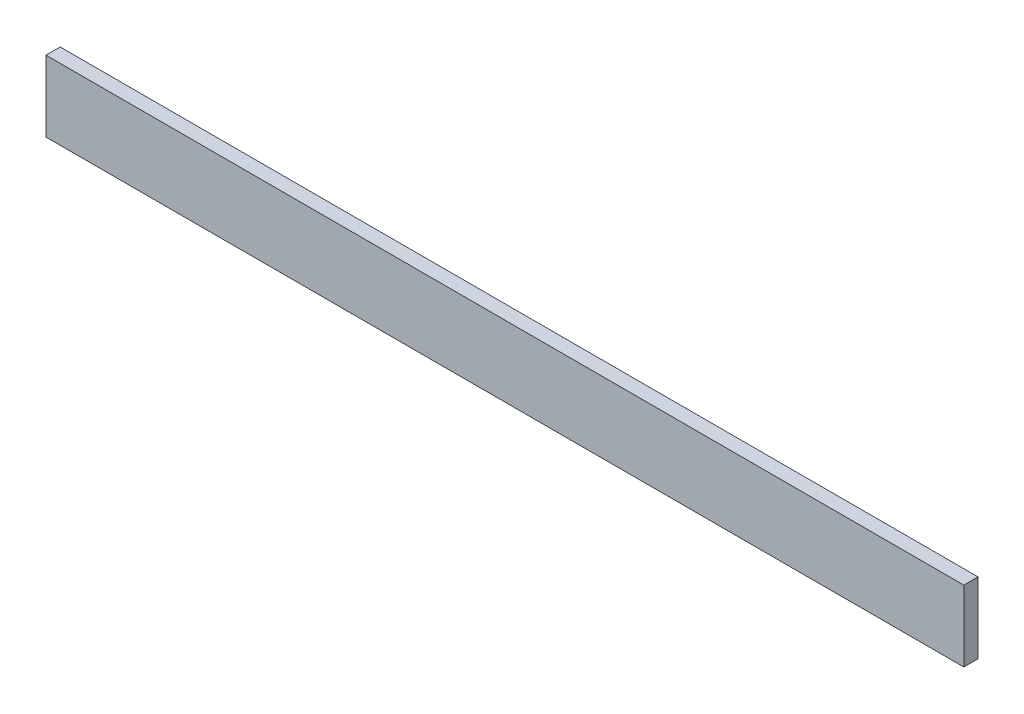
ISO-10303-21;
HEADER;
FILE_DESCRIPTION(('STEP AP214'),'2;1');
FILE_NAME('part.step','',(''),(''),'','','');
FILE_SCHEMA(('AUTOMOTIVE_DESIGN { 1 0 10303 214 1 1 1 1 }'));
ENDSEC;
DATA;
#1=APPLICATION_CONTEXT('core data for automotive mechanical design processes');
#2=APPLICATION_PROTOCOL_DEFINITION('international standard','automotive_design',2000,#1);
#3=PRODUCT_CONTEXT('',#1,'mechanical');
#4=PRODUCT('Part','Part','',(#3));
#5=PRODUCT_RELATED_PRODUCT_CATEGORY('part','',(#4));
#6=PRODUCT_DEFINITION_FORMATION('','',#4);
#7=PRODUCT_DEFINITION_CONTEXT('part definition',#1,'design');
#8=PRODUCT_DEFINITION('design','',#6,#7);
#9=PRODUCT_DEFINITION_SHAPE('','',#8);
#10=(LENGTH_UNIT() NAMED_UNIT(*) SI_UNIT(.MILLI.,.METRE.));
#11=(NAMED_UNIT(*) PLANE_ANGLE_UNIT() SI_UNIT($,.RADIAN.));
#12=(NAMED_UNIT(*) SI_UNIT($,.STERADIAN.) SOLID_ANGLE_UNIT());
#13=UNCERTAINTY_MEASURE_WITH_UNIT(LENGTH_MEASURE(1.E-05),#10,'distance_accuracy_value','');
#14=(GEOMETRIC_REPRESENTATION_CONTEXT(3) GLOBAL_UNCERTAINTY_ASSIGNED_CONTEXT((#13)) GLOBAL_UNIT_ASSIGNED_CONTEXT((#10,
#11,#12)) REPRESENTATION_CONTEXT('',''));
#15=CARTESIAN_POINT('',(0.,0.,0.));
#16=DIRECTION('',(0.,0.,1.));
#17=DIRECTION('',(1.,0.,0.));
#18=AXIS2_PLACEMENT_3D('',#15,#16,#17);
#19=CARTESIAN_POINT('',(0.,0.,15.));
#20=DIRECTION('',(1.,0.,0.));
#21=DIRECTION('',(0.,0.,-1.));
#22=AXIS2_PLACEMENT_3D('',#19,#20,#21);
#23=PLANE('',#22);
#24=DIRECTION('',(0.,-1.,0.));
#25=VECTOR('',#24,1.);
#26=CARTESIAN_POINT('',(0.,0.,0.));
#27=LINE('',#26,#25);
#28=CARTESIAN_POINT('',(0.,75.,0.));
#29=VERTEX_POINT('',#28);
#30=CARTESIAN_POINT('',(0.,0.,0.));
#31=VERTEX_POINT('',#30);
#32=EDGE_CURVE('E107',#29,#31,#27,.T.);
#33=ORIENTED_EDGE('',*,*,#32,.T.);
#34=DIRECTION('',(0.,0.,-1.));
#35=VECTOR('',#34,1.);
#36=CARTESIAN_POINT('',(0.,0.,15.));
#37=LINE('',#36,#35);
#38=CARTESIAN_POINT('',(0.,0.,15.));
#39=VERTEX_POINT('',#38);
#40=EDGE_CURVE('E11',#39,#31,#37,.T.);
#41=ORIENTED_EDGE('',*,*,#40,.F.);
#42=DIRECTION('',(0.,-1.,0.));
#43=VECTOR('',#42,1.);
#44=CARTESIAN_POINT('',(0.,0.,15.));
#45=LINE('',#44,#43);
#46=CARTESIAN_POINT('',(0.,75.,15.));
#47=VERTEX_POINT('',#46);
#48=EDGE_CURVE('E96',#47,#39,#45,.T.);
#49=ORIENTED_EDGE('',*,*,#48,.F.);
#50=DIRECTION('',(0.,0.,-1.));
#51=VECTOR('',#50,1.);
#52=CARTESIAN_POINT('',(0.,75.,15.));
#53=LINE('',#52,#51);
#54=EDGE_CURVE('E102',#47,#29,#53,.T.);
#55=ORIENTED_EDGE('',*,*,#54,.T.);
#56=EDGE_LOOP('',(#33,#41,#49,#55));
#57=FACE_BOUND('',#56,.T.);
#58=ADVANCED_FACE('F44',(#57),#23,.F.);
#59=CARTESIAN_POINT('',(0.,0.,15.));
#60=DIRECTION('',(0.,1.,0.));
#61=DIRECTION('',(0.,0.,1.));
#62=AXIS2_PLACEMENT_3D('',#59,#60,#61);
#63=PLANE('',#62);
#64=DIRECTION('',(1.,0.,0.));
#65=VECTOR('',#64,1.);
#66=CARTESIAN_POINT('',(0.,0.,0.));
#67=LINE('',#66,#65);
#68=CARTESIAN_POINT('',(970.,0.,0.));
#69=VERTEX_POINT('',#68);
#70=EDGE_CURVE('E99',#31,#69,#67,.T.);
#71=ORIENTED_EDGE('',*,*,#70,.T.);
#72=DIRECTION('',(0.,0.,-1.));
#73=VECTOR('',#72,1.);
#74=CARTESIAN_POINT('',(970.,0.,15.));
#75=LINE('',#74,#73);
#76=CARTESIAN_POINT('',(970.,0.,15.));
#77=VERTEX_POINT('',#76);
#78=EDGE_CURVE('E52',#77,#69,#75,.T.);
#79=ORIENTED_EDGE('',*,*,#78,.F.);
#80=DIRECTION('',(1.,0.,0.));
#81=VECTOR('',#80,1.);
#82=CARTESIAN_POINT('',(0.,0.,15.));
#83=LINE('',#82,#81);
#84=EDGE_CURVE('E93',#39,#77,#83,.T.);
#85=ORIENTED_EDGE('',*,*,#84,.F.);
#86=ORIENTED_EDGE('',*,*,#40,.T.);
#87=EDGE_LOOP('',(#71,#79,#85,#86));
#88=FACE_BOUND('',#87,.T.);
#89=ADVANCED_FACE('F97',(#88),#63,.F.);
#90=CARTESIAN_POINT('',(970.,0.,15.));
#91=DIRECTION('',(-1.,0.,0.));
#92=DIRECTION('',(0.,0.,1.));
#93=AXIS2_PLACEMENT_3D('',#90,#91,#92);
#94=PLANE('',#93);
#95=DIRECTION('',(0.,1.,0.));
#96=VECTOR('',#95,1.);
#97=CARTESIAN_POINT('',(970.,0.,0.));
#98=LINE('',#97,#96);
#99=CARTESIAN_POINT('',(970.,75.,0.));
#100=VERTEX_POINT('',#99);
#101=EDGE_CURVE('E79',#69,#100,#98,.T.);
#102=ORIENTED_EDGE('',*,*,#101,.T.);
#103=DIRECTION('',(0.,0.,-1.));
#104=VECTOR('',#103,1.);
#105=CARTESIAN_POINT('',(970.,75.,15.));
#106=LINE('',#105,#104);
#107=CARTESIAN_POINT('',(970.,75.,15.));
#108=VERTEX_POINT('',#107);
#109=EDGE_CURVE('E101',#108,#100,#106,.T.);
#110=ORIENTED_EDGE('',*,*,#109,.F.);
#111=DIRECTION('',(0.,1.,0.));
#112=VECTOR('',#111,1.);
#113=CARTESIAN_POINT('',(970.,0.,15.));
#114=LINE('',#113,#112);
#115=EDGE_CURVE('E94',#77,#108,#114,.T.);
#116=ORIENTED_EDGE('',*,*,#115,.F.);
#117=ORIENTED_EDGE('',*,*,#78,.T.);
#118=EDGE_LOOP('',(#102,#110,#116,#117));
#119=FACE_BOUND('',#118,.T.);
#120=ADVANCED_FACE('F105',(#119),#94,.F.);
#121=CARTESIAN_POINT('',(0.,75.,15.));
#122=DIRECTION('',(0.,-1.,0.));
#123=DIRECTION('',(0.,0.,-1.));
#124=AXIS2_PLACEMENT_3D('',#121,#122,#123);
#125=PLANE('',#124);
#126=DIRECTION('',(-1.,0.,0.));
#127=VECTOR('',#126,1.);
#128=CARTESIAN_POINT('',(0.,75.,0.));
#129=LINE('',#128,#127);
#130=EDGE_CURVE('E85',#100,#29,#129,.T.);
#131=ORIENTED_EDGE('',*,*,#130,.T.);
#132=ORIENTED_EDGE('',*,*,#54,.F.);
#133=DIRECTION('',(-1.,0.,0.));
#134=VECTOR('',#133,1.);
#135=CARTESIAN_POINT('',(0.,75.,15.));
#136=LINE('',#135,#134);
#137=EDGE_CURVE('E62',#108,#47,#136,.T.);
#138=ORIENTED_EDGE('',*,*,#137,.F.);
#139=ORIENTED_EDGE('',*,*,#109,.T.);
#140=EDGE_LOOP('',(#131,#132,#138,#139));
#141=FACE_BOUND('',#140,.T.);
#142=ADVANCED_FACE('F113',(#141),#125,.F.);
#143=CARTESIAN_POINT('',(0.,0.,15.));
#144=DIRECTION('',(0.,0.,-1.));
#145=DIRECTION('',(-1.,0.,0.));
#146=AXIS2_PLACEMENT_3D('',#143,#144,#145);
#147=PLANE('',#146);
#148=ORIENTED_EDGE('',*,*,#48,.T.);
#149=ORIENTED_EDGE('',*,*,#84,.T.);
#150=ORIENTED_EDGE('',*,*,#115,.T.);
#151=ORIENTED_EDGE('',*,*,#137,.T.);
#152=EDGE_LOOP('',(#148,#149,#150,#151));
#153=FACE_BOUND('',#152,.T.);
#154=ADVANCED_FACE('F95',(#153),#147,.F.);
#155=CARTESIAN_POINT('',(0.,0.,0.));
#156=DIRECTION('',(0.,0.,-1.));
#157=DIRECTION('',(-1.,0.,0.));
#158=AXIS2_PLACEMENT_3D('',#155,#156,#157);
#159=PLANE('',#158);
#160=ORIENTED_EDGE('',*,*,#32,.F.);
#161=ORIENTED_EDGE('',*,*,#130,.F.);
#162=ORIENTED_EDGE('',*,*,#101,.F.);
#163=ORIENTED_EDGE('',*,*,#70,.F.);
#164=EDGE_LOOP('',(#160,#161,#162,#163));
#165=FACE_BOUND('',#164,.T.);
#166=ADVANCED_FACE('F119',(#165),#159,.T.);
#167=CLOSED_SHELL('',(#58,#89,#120,#142,#154,#166));
#168=MANIFOLD_SOLID_BREP('B2',#167);
#169=ADVANCED_BREP_SHAPE_REPRESENTATION('',(#18,#168),#14);
#170=SHAPE_DEFINITION_REPRESENTATION(#9,#169);
ENDSEC;
END-ISO-10303-21;
